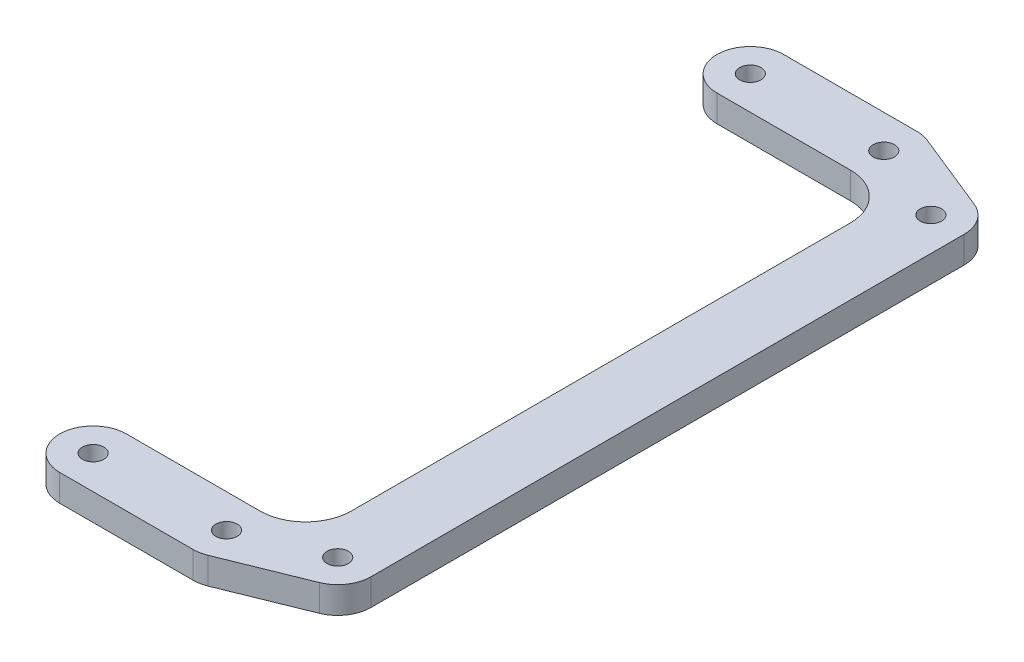
ISO-10303-21;
HEADER;
FILE_DESCRIPTION(('STEP AP214'),'2;1');
FILE_NAME('part.step','',(''),(''),'','','');
FILE_SCHEMA(('AUTOMOTIVE_DESIGN { 1 0 10303 214 1 1 1 1 }'));
ENDSEC;
DATA;
#1=APPLICATION_CONTEXT('core data for automotive mechanical design processes');
#2=APPLICATION_PROTOCOL_DEFINITION('international standard','automotive_design',2000,#1);
#3=PRODUCT_CONTEXT('',#1,'mechanical');
#4=PRODUCT('Part','Part','',(#3));
#5=PRODUCT_RELATED_PRODUCT_CATEGORY('part','',(#4));
#6=PRODUCT_DEFINITION_FORMATION('','',#4);
#7=PRODUCT_DEFINITION_CONTEXT('part definition',#1,'design');
#8=PRODUCT_DEFINITION('design','',#6,#7);
#9=PRODUCT_DEFINITION_SHAPE('','',#8);
#10=(LENGTH_UNIT() NAMED_UNIT(*) SI_UNIT(.MILLI.,.METRE.));
#11=(NAMED_UNIT(*) PLANE_ANGLE_UNIT() SI_UNIT($,.RADIAN.));
#12=(NAMED_UNIT(*) SI_UNIT($,.STERADIAN.) SOLID_ANGLE_UNIT());
#13=UNCERTAINTY_MEASURE_WITH_UNIT(LENGTH_MEASURE(1.E-05),#10,'distance_accuracy_value','');
#14=(GEOMETRIC_REPRESENTATION_CONTEXT(3) GLOBAL_UNCERTAINTY_ASSIGNED_CONTEXT((#13)) GLOBAL_UNIT_ASSIGNED_CONTEXT((#10,
#11,#12)) REPRESENTATION_CONTEXT('',''));
#15=CARTESIAN_POINT('',(0.,0.,0.));
#16=DIRECTION('',(0.,0.,1.));
#17=DIRECTION('',(1.,0.,0.));
#18=AXIS2_PLACEMENT_3D('',#15,#16,#17);
#19=CARTESIAN_POINT('',(19.0029318751509,4.,46.9530775081852));
#20=DIRECTION('',(-0.375160778388513,0.,-0.926959756601615));
#21=DIRECTION('',(-0.926959756601615,0.,0.375160778388513));
#22=AXIS2_PLACEMENT_3D('',#19,#20,#21);
#23=PLANE('',#22);
#24=DIRECTION('',(0.926959756601615,0.,-0.375160778388513));
#25=VECTOR('',#24,1.);
#26=CARTESIAN_POINT('',(19.0029318751509,0.,46.9530775081852));
#27=LINE('',#26,#25);
#28=CARTESIAN_POINT('',(1.87580389194258,0.,53.8847987830081));
#29=VERTEX_POINT('',#28);
#30=CARTESIAN_POINT('',(13.7358038919426,0.,49.0847987830081));
#31=VERTEX_POINT('',#30);
#32=EDGE_CURVE('E201',#29,#31,#27,.T.);
#33=ORIENTED_EDGE('',*,*,#32,.T.);
#34=DIRECTION('',(0.,-1.,0.));
#35=VECTOR('',#34,1.);
#36=CARTESIAN_POINT('',(13.7358038919426,4.,49.0847987830081));
#37=LINE('',#36,#35);
#38=CARTESIAN_POINT('',(13.7358038919426,4.,49.0847987830081));
#39=VERTEX_POINT('',#38);
#40=EDGE_CURVE('E11',#39,#31,#37,.T.);
#41=ORIENTED_EDGE('',*,*,#40,.F.);
#42=DIRECTION('',(0.926959756601615,0.,-0.375160778388513));
#43=VECTOR('',#42,1.);
#44=CARTESIAN_POINT('',(19.0029318751509,4.,46.9530775081852));
#45=LINE('',#44,#43);
#46=CARTESIAN_POINT('',(1.87580389194258,4.,53.8847987830081));
#47=VERTEX_POINT('',#46);
#48=EDGE_CURVE('E260',#47,#39,#45,.T.);
#49=ORIENTED_EDGE('',*,*,#48,.F.);
#50=DIRECTION('',(0.,-1.,0.));
#51=VECTOR('',#50,1.);
#52=CARTESIAN_POINT('',(1.87580389194258,4.,53.8847987830081));
#53=LINE('',#52,#51);
#54=EDGE_CURVE('E51',#47,#29,#53,.T.);
#55=ORIENTED_EDGE('',*,*,#54,.T.);
#56=EDGE_LOOP('',(#33,#41,#49,#55));
#57=FACE_BOUND('',#56,.T.);
#58=ADVANCED_FACE('F35',(#57),#23,.F.);
#59=CARTESIAN_POINT('',(11.86,4.,44.45));
#60=DIRECTION('',(0.,-1.,0.));
#61=DIRECTION('',(0.,0.,-1.));
#62=AXIS2_PLACEMENT_3D('',#59,#60,#61);
#63=CYLINDRICAL_SURFACE('',#62,5.00000000000001);
#64=CARTESIAN_POINT('',(11.86,0.,44.45));
#65=DIRECTION('',(0.,1.,0.));
#66=DIRECTION('',(0.,0.,1.));
#67=AXIS2_PLACEMENT_3D('',#64,#65,#66);
#68=CIRCLE('',#67,5.00000000000001);
#69=CARTESIAN_POINT('',(16.86,0.,44.45));
#70=VERTEX_POINT('',#69);
#71=EDGE_CURVE('E203',#31,#70,#68,.T.);
#72=ORIENTED_EDGE('',*,*,#71,.T.);
#73=DIRECTION('',(0.,-1.,0.));
#74=VECTOR('',#73,1.);
#75=CARTESIAN_POINT('',(16.86,4.,44.45));
#76=LINE('',#75,#74);
#77=CARTESIAN_POINT('',(16.86,4.,44.45));
#78=VERTEX_POINT('',#77);
#79=EDGE_CURVE('E43',#78,#70,#76,.T.);
#80=ORIENTED_EDGE('',*,*,#79,.F.);
#81=CARTESIAN_POINT('',(11.86,4.,44.45));
#82=DIRECTION('',(0.,1.,0.));
#83=DIRECTION('',(0.,0.,1.));
#84=AXIS2_PLACEMENT_3D('',#81,#82,#83);
#85=CIRCLE('',#84,5.00000000000001);
#86=EDGE_CURVE('E114',#39,#78,#85,.T.);
#87=ORIENTED_EDGE('',*,*,#86,.F.);
#88=ORIENTED_EDGE('',*,*,#40,.T.);
#89=EDGE_LOOP('',(#72,#80,#87,#88));
#90=FACE_BOUND('',#89,.T.);
#91=ADVANCED_FACE('F292',(#90),#63,.T.);
#92=CARTESIAN_POINT('',(16.86,4.,0.));
#93=DIRECTION('',(1.,0.,0.));
#94=DIRECTION('',(0.,0.,-1.));
#95=AXIS2_PLACEMENT_3D('',#92,#93,#94);
#96=PLANE('',#95);
#97=DIRECTION('',(0.,0.,1.));
#98=VECTOR('',#97,1.);
#99=CARTESIAN_POINT('',(16.86,0.,0.));
#100=LINE('',#99,#98);
#101=CARTESIAN_POINT('',(16.86,0.,-44.45));
#102=VERTEX_POINT('',#101);
#103=EDGE_CURVE('E206',#102,#70,#100,.T.);
#104=ORIENTED_EDGE('',*,*,#103,.F.);
#105=DIRECTION('',(0.,-1.,0.));
#106=VECTOR('',#105,1.);
#107=CARTESIAN_POINT('',(16.86,4.,-44.45));
#108=LINE('',#107,#106);
#109=CARTESIAN_POINT('',(16.86,4.,-44.45));
#110=VERTEX_POINT('',#109);
#111=EDGE_CURVE('E285',#110,#102,#108,.T.);
#112=ORIENTED_EDGE('',*,*,#111,.F.);
#113=DIRECTION('',(0.,0.,1.));
#114=VECTOR('',#113,1.);
#115=CARTESIAN_POINT('',(16.86,4.,0.));
#116=LINE('',#115,#114);
#117=EDGE_CURVE('E291',#110,#78,#116,.T.);
#118=ORIENTED_EDGE('',*,*,#117,.T.);
#119=ORIENTED_EDGE('',*,*,#79,.T.);
#120=EDGE_LOOP('',(#104,#112,#118,#119));
#121=FACE_BOUND('',#120,.T.);
#122=ADVANCED_FACE('F289',(#121),#96,.T.);
#123=CARTESIAN_POINT('',(11.86,4.,-44.45));
#124=DIRECTION('',(0.,-1.,0.));
#125=DIRECTION('',(0.,0.,-1.));
#126=AXIS2_PLACEMENT_3D('',#123,#124,#125);
#127=CYLINDRICAL_SURFACE('',#126,5.00000000000001);
#128=CARTESIAN_POINT('',(11.86,0.,-44.45));
#129=DIRECTION('',(0.,1.,0.));
#130=DIRECTION('',(0.,0.,1.));
#131=AXIS2_PLACEMENT_3D('',#128,#129,#130);
#132=CIRCLE('',#131,5.00000000000001);
#133=CARTESIAN_POINT('',(13.7358038919426,0.,-49.0847987830081));
#134=VERTEX_POINT('',#133);
#135=EDGE_CURVE('E209',#102,#134,#132,.T.);
#136=ORIENTED_EDGE('',*,*,#135,.T.);
#137=DIRECTION('',(0.,-1.,0.));
#138=VECTOR('',#137,1.);
#139=CARTESIAN_POINT('',(13.7358038919426,4.,-49.0847987830081));
#140=LINE('',#139,#138);
#141=CARTESIAN_POINT('',(13.7358038919426,4.,-49.0847987830081));
#142=VERTEX_POINT('',#141);
#143=EDGE_CURVE('E283',#142,#134,#140,.T.);
#144=ORIENTED_EDGE('',*,*,#143,.F.);
#145=CARTESIAN_POINT('',(11.86,4.,-44.45));
#146=DIRECTION('',(0.,1.,0.));
#147=DIRECTION('',(0.,0.,1.));
#148=AXIS2_PLACEMENT_3D('',#145,#146,#147);
#149=CIRCLE('',#148,5.00000000000001);
#150=EDGE_CURVE('E305',#110,#142,#149,.T.);
#151=ORIENTED_EDGE('',*,*,#150,.F.);
#152=ORIENTED_EDGE('',*,*,#111,.T.);
#153=EDGE_LOOP('',(#136,#144,#151,#152));
#154=FACE_BOUND('',#153,.T.);
#155=ADVANCED_FACE('F302',(#154),#127,.T.);
#156=CARTESIAN_POINT('',(19.0029318751509,4.,-46.9530775081852));
#157=DIRECTION('',(0.375160778388513,0.,-0.926959756601615));
#158=DIRECTION('',(-0.926959756601615,0.,-0.375160778388513));
#159=AXIS2_PLACEMENT_3D('',#156,#157,#158);
#160=PLANE('',#159);
#161=DIRECTION('',(0.926959756601615,0.,0.375160778388513));
#162=VECTOR('',#161,1.);
#163=CARTESIAN_POINT('',(19.0029318751509,0.,-46.9530775081852));
#164=LINE('',#163,#162);
#165=CARTESIAN_POINT('',(1.87580389194258,0.,-53.8847987830081));
#166=VERTEX_POINT('',#165);
#167=EDGE_CURVE('E212',#166,#134,#164,.T.);
#168=ORIENTED_EDGE('',*,*,#167,.F.);
#169=DIRECTION('',(0.,-1.,0.));
#170=VECTOR('',#169,1.);
#171=CARTESIAN_POINT('',(1.87580389194258,4.,-53.8847987830081));
#172=LINE('',#171,#170);
#173=CARTESIAN_POINT('',(1.87580389194258,4.,-53.8847987830081));
#174=VERTEX_POINT('',#173);
#175=EDGE_CURVE('E281',#174,#166,#172,.T.);
#176=ORIENTED_EDGE('',*,*,#175,.F.);
#177=DIRECTION('',(0.926959756601615,0.,0.375160778388513));
#178=VECTOR('',#177,1.);
#179=CARTESIAN_POINT('',(19.0029318751509,4.,-46.9530775081852));
#180=LINE('',#179,#178);
#181=EDGE_CURVE('E307',#174,#142,#180,.T.);
#182=ORIENTED_EDGE('',*,*,#181,.T.);
#183=ORIENTED_EDGE('',*,*,#143,.T.);
#184=EDGE_LOOP('',(#168,#176,#182,#183));
#185=FACE_BOUND('',#184,.T.);
#186=ADVANCED_FACE('F361',(#185),#160,.T.);
#187=CARTESIAN_POINT('',(0.,4.,-49.25));
#188=DIRECTION('',(0.,-1.,0.));
#189=DIRECTION('',(0.,0.,-1.));
#190=AXIS2_PLACEMENT_3D('',#187,#188,#189);
#191=CYLINDRICAL_SURFACE('',#190,5.);
#192=CARTESIAN_POINT('',(0.,0.,-49.25));
#193=DIRECTION('',(0.,1.,0.));
#194=DIRECTION('',(0.,0.,1.));
#195=AXIS2_PLACEMENT_3D('',#192,#193,#194);
#196=CIRCLE('',#195,5.);
#197=CARTESIAN_POINT('',(0.,0.,-54.25));
#198=VERTEX_POINT('',#197);
#199=EDGE_CURVE('E215',#166,#198,#196,.T.);
#200=ORIENTED_EDGE('',*,*,#199,.T.);
#201=DIRECTION('',(0.,-1.,0.));
#202=VECTOR('',#201,1.);
#203=CARTESIAN_POINT('',(0.,4.,-54.25));
#204=LINE('',#203,#202);
#205=CARTESIAN_POINT('',(0.,4.,-54.25));
#206=VERTEX_POINT('',#205);
#207=EDGE_CURVE('E279',#206,#198,#204,.T.);
#208=ORIENTED_EDGE('',*,*,#207,.F.);
#209=CARTESIAN_POINT('',(0.,4.,-49.25));
#210=DIRECTION('',(0.,1.,0.));
#211=DIRECTION('',(0.,0.,1.));
#212=AXIS2_PLACEMENT_3D('',#209,#210,#211);
#213=CIRCLE('',#212,5.);
#214=EDGE_CURVE('E314',#174,#206,#213,.T.);
#215=ORIENTED_EDGE('',*,*,#214,.F.);
#216=ORIENTED_EDGE('',*,*,#175,.T.);
#217=EDGE_LOOP('',(#200,#208,#215,#216));
#218=FACE_BOUND('',#217,.T.);
#219=ADVANCED_FACE('F364',(#218),#191,.T.);
#220=CARTESIAN_POINT('',(0.,4.,-54.25));
#221=DIRECTION('',(0.,0.,-1.));
#222=DIRECTION('',(-1.,0.,0.));
#223=AXIS2_PLACEMENT_3D('',#220,#221,#222);
#224=PLANE('',#223);
#225=DIRECTION('',(1.,0.,0.));
#226=VECTOR('',#225,1.);
#227=CARTESIAN_POINT('',(0.,0.,-54.25));
#228=LINE('',#227,#226);
#229=CARTESIAN_POINT('',(-20.,0.,-54.25));
#230=VERTEX_POINT('',#229);
#231=EDGE_CURVE('E218',#230,#198,#228,.T.);
#232=ORIENTED_EDGE('',*,*,#231,.F.);
#233=DIRECTION('',(0.,-1.,0.));
#234=VECTOR('',#233,1.);
#235=CARTESIAN_POINT('',(-20.,4.,-54.25));
#236=LINE('',#235,#234);
#237=CARTESIAN_POINT('',(-20.,4.,-54.25));
#238=VERTEX_POINT('',#237);
#239=EDGE_CURVE('E277',#238,#230,#236,.T.);
#240=ORIENTED_EDGE('',*,*,#239,.F.);
#241=DIRECTION('',(1.,0.,0.));
#242=VECTOR('',#241,1.);
#243=CARTESIAN_POINT('',(0.,4.,-54.25));
#244=LINE('',#243,#242);
#245=EDGE_CURVE('E316',#238,#206,#244,.T.);
#246=ORIENTED_EDGE('',*,*,#245,.T.);
#247=ORIENTED_EDGE('',*,*,#207,.T.);
#248=EDGE_LOOP('',(#232,#240,#246,#247));
#249=FACE_BOUND('',#248,.T.);
#250=ADVANCED_FACE('F368',(#249),#224,.T.);
#251=CARTESIAN_POINT('',(-20.,4.,-49.25));
#252=DIRECTION('',(0.,-1.,0.));
#253=DIRECTION('',(0.,0.,-1.));
#254=AXIS2_PLACEMENT_3D('',#251,#252,#253);
#255=CYLINDRICAL_SURFACE('',#254,5.);
#256=CARTESIAN_POINT('',(-20.,0.,-49.25));
#257=DIRECTION('',(0.,1.,0.));
#258=DIRECTION('',(0.,0.,1.));
#259=AXIS2_PLACEMENT_3D('',#256,#257,#258);
#260=CIRCLE('',#259,5.);
#261=CARTESIAN_POINT('',(-20.,0.,-44.25));
#262=VERTEX_POINT('',#261);
#263=EDGE_CURVE('E221',#230,#262,#260,.T.);
#264=ORIENTED_EDGE('',*,*,#263,.T.);
#265=DIRECTION('',(0.,-1.,0.));
#266=VECTOR('',#265,1.);
#267=CARTESIAN_POINT('',(-20.,4.,-44.25));
#268=LINE('',#267,#266);
#269=CARTESIAN_POINT('',(-20.,4.,-44.25));
#270=VERTEX_POINT('',#269);
#271=EDGE_CURVE('E274',#270,#262,#268,.T.);
#272=ORIENTED_EDGE('',*,*,#271,.F.);
#273=CARTESIAN_POINT('',(-20.,4.,-49.25));
#274=DIRECTION('',(0.,1.,0.));
#275=DIRECTION('',(0.,0.,1.));
#276=AXIS2_PLACEMENT_3D('',#273,#274,#275);
#277=CIRCLE('',#276,5.);
#278=EDGE_CURVE('E319',#238,#270,#277,.T.);
#279=ORIENTED_EDGE('',*,*,#278,.F.);
#280=ORIENTED_EDGE('',*,*,#239,.T.);
#281=EDGE_LOOP('',(#264,#272,#279,#280));
#282=FACE_BOUND('',#281,.T.);
#283=ADVANCED_FACE('F372',(#282),#255,.T.);
#284=CARTESIAN_POINT('',(0.,4.,-44.25));
#285=DIRECTION('',(0.,0.,-1.));
#286=DIRECTION('',(-1.,0.,0.));
#287=AXIS2_PLACEMENT_3D('',#284,#285,#286);
#288=PLANE('',#287);
#289=DIRECTION('',(1.,0.,0.));
#290=VECTOR('',#289,1.);
#291=CARTESIAN_POINT('',(0.,0.,-44.25));
#292=LINE('',#291,#290);
#293=CARTESIAN_POINT('',(0.,0.,-44.25));
#294=VERTEX_POINT('',#293);
#295=EDGE_CURVE('E223',#262,#294,#292,.T.);
#296=ORIENTED_EDGE('',*,*,#295,.T.);
#297=DIRECTION('',(0.,-1.,0.));
#298=VECTOR('',#297,1.);
#299=CARTESIAN_POINT('',(0.,4.,-44.25));
#300=LINE('',#299,#298);
#301=CARTESIAN_POINT('',(0.,4.,-44.25));
#302=VERTEX_POINT('',#301);
#303=EDGE_CURVE('E271',#302,#294,#300,.T.);
#304=ORIENTED_EDGE('',*,*,#303,.F.);
#305=DIRECTION('',(1.,0.,0.));
#306=VECTOR('',#305,1.);
#307=CARTESIAN_POINT('',(0.,4.,-44.25));
#308=LINE('',#307,#306);
#309=EDGE_CURVE('E321',#270,#302,#308,.T.);
#310=ORIENTED_EDGE('',*,*,#309,.F.);
#311=ORIENTED_EDGE('',*,*,#271,.T.);
#312=EDGE_LOOP('',(#296,#304,#310,#311));
#313=FACE_BOUND('',#312,.T.);
#314=ADVANCED_FACE('F376',(#313),#288,.F.);
#315=CARTESIAN_POINT('',(0.,4.,-37.39));
#316=DIRECTION('',(0.,-1.,0.));
#317=DIRECTION('',(0.,0.,-1.));
#318=AXIS2_PLACEMENT_3D('',#315,#316,#317);
#319=CYLINDRICAL_SURFACE('',#318,6.86);
#320=CARTESIAN_POINT('',(0.,0.,-37.39));
#321=DIRECTION('',(0.,1.,0.));
#322=DIRECTION('',(0.,0.,1.));
#323=AXIS2_PLACEMENT_3D('',#320,#321,#322);
#324=CIRCLE('',#323,6.86);
#325=CARTESIAN_POINT('',(6.86,0.,-37.39));
#326=VERTEX_POINT('',#325);
#327=EDGE_CURVE('E225',#294,#326,#324,.F.);
#328=ORIENTED_EDGE('',*,*,#327,.T.);
#329=DIRECTION('',(0.,-1.,0.));
#330=VECTOR('',#329,1.);
#331=CARTESIAN_POINT('',(6.86,4.,-37.39));
#332=LINE('',#331,#330);
#333=CARTESIAN_POINT('',(6.86,4.,-37.39));
#334=VERTEX_POINT('',#333);
#335=EDGE_CURVE('E268',#334,#326,#332,.T.);
#336=ORIENTED_EDGE('',*,*,#335,.F.);
#337=CARTESIAN_POINT('',(0.,4.,-37.39));
#338=DIRECTION('',(0.,1.,0.));
#339=DIRECTION('',(0.,0.,1.));
#340=AXIS2_PLACEMENT_3D('',#337,#338,#339);
#341=CIRCLE('',#340,6.86);
#342=EDGE_CURVE('E323',#302,#334,#341,.F.);
#343=ORIENTED_EDGE('',*,*,#342,.F.);
#344=ORIENTED_EDGE('',*,*,#303,.T.);
#345=EDGE_LOOP('',(#328,#336,#343,#344));
#346=FACE_BOUND('',#345,.T.);
#347=ADVANCED_FACE('F380',(#346),#319,.F.);
#348=CARTESIAN_POINT('',(6.86,4.,0.));
#349=DIRECTION('',(1.,0.,0.));
#350=DIRECTION('',(0.,0.,-1.));
#351=AXIS2_PLACEMENT_3D('',#348,#349,#350);
#352=PLANE('',#351);
#353=DIRECTION('',(0.,0.,1.));
#354=VECTOR('',#353,1.);
#355=CARTESIAN_POINT('',(6.86,0.,0.));
#356=LINE('',#355,#354);
#357=CARTESIAN_POINT('',(6.86,0.,37.39));
#358=VERTEX_POINT('',#357);
#359=EDGE_CURVE('E227',#326,#358,#356,.T.);
#360=ORIENTED_EDGE('',*,*,#359,.T.);
#361=DIRECTION('',(0.,-1.,0.));
#362=VECTOR('',#361,1.);
#363=CARTESIAN_POINT('',(6.86,4.,37.39));
#364=LINE('',#363,#362);
#365=CARTESIAN_POINT('',(6.86,4.,37.39));
#366=VERTEX_POINT('',#365);
#367=EDGE_CURVE('E266',#366,#358,#364,.T.);
#368=ORIENTED_EDGE('',*,*,#367,.F.);
#369=DIRECTION('',(0.,0.,1.));
#370=VECTOR('',#369,1.);
#371=CARTESIAN_POINT('',(6.86,4.,0.));
#372=LINE('',#371,#370);
#373=EDGE_CURVE('E325',#334,#366,#372,.T.);
#374=ORIENTED_EDGE('',*,*,#373,.F.);
#375=ORIENTED_EDGE('',*,*,#335,.T.);
#376=EDGE_LOOP('',(#360,#368,#374,#375));
#377=FACE_BOUND('',#376,.T.);
#378=ADVANCED_FACE('F384',(#377),#352,.F.);
#379=CARTESIAN_POINT('',(0.,4.,37.39));
#380=DIRECTION('',(0.,-1.,0.));
#381=DIRECTION('',(0.,0.,-1.));
#382=AXIS2_PLACEMENT_3D('',#379,#380,#381);
#383=CYLINDRICAL_SURFACE('',#382,6.86);
#384=CARTESIAN_POINT('',(0.,0.,37.39));
#385=DIRECTION('',(0.,1.,0.));
#386=DIRECTION('',(0.,0.,1.));
#387=AXIS2_PLACEMENT_3D('',#384,#385,#386);
#388=CIRCLE('',#387,6.86);
#389=CARTESIAN_POINT('',(0.,0.,44.25));
#390=VERTEX_POINT('',#389);
#391=EDGE_CURVE('E230',#390,#358,#388,.T.);
#392=ORIENTED_EDGE('',*,*,#391,.F.);
#393=DIRECTION('',(0.,-1.,0.));
#394=VECTOR('',#393,1.);
#395=CARTESIAN_POINT('',(0.,4.,44.25));
#396=LINE('',#395,#394);
#397=CARTESIAN_POINT('',(0.,4.,44.25));
#398=VERTEX_POINT('',#397);
#399=EDGE_CURVE('E264',#398,#390,#396,.T.);
#400=ORIENTED_EDGE('',*,*,#399,.F.);
#401=CARTESIAN_POINT('',(0.,4.,37.39));
#402=DIRECTION('',(0.,1.,0.));
#403=DIRECTION('',(0.,0.,1.));
#404=AXIS2_PLACEMENT_3D('',#401,#402,#403);
#405=CIRCLE('',#404,6.86);
#406=EDGE_CURVE('E178',#398,#366,#405,.T.);
#407=ORIENTED_EDGE('',*,*,#406,.T.);
#408=ORIENTED_EDGE('',*,*,#367,.T.);
#409=EDGE_LOOP('',(#392,#400,#407,#408));
#410=FACE_BOUND('',#409,.T.);
#411=ADVANCED_FACE('F329',(#410),#383,.F.);
#412=CARTESIAN_POINT('',(0.,4.,44.25));
#413=DIRECTION('',(0.,0.,-1.));
#414=DIRECTION('',(-1.,0.,0.));
#415=AXIS2_PLACEMENT_3D('',#412,#413,#414);
#416=PLANE('',#415);
#417=DIRECTION('',(1.,0.,0.));
#418=VECTOR('',#417,1.);
#419=CARTESIAN_POINT('',(0.,0.,44.25));
#420=LINE('',#419,#418);
#421=CARTESIAN_POINT('',(-20.,0.,44.25));
#422=VERTEX_POINT('',#421);
#423=EDGE_CURVE('E233',#422,#390,#420,.T.);
#424=ORIENTED_EDGE('',*,*,#423,.F.);
#425=DIRECTION('',(0.,-1.,0.));
#426=VECTOR('',#425,1.);
#427=CARTESIAN_POINT('',(-20.,4.,44.25));
#428=LINE('',#427,#426);
#429=CARTESIAN_POINT('',(-20.,4.,44.25));
#430=VERTEX_POINT('',#429);
#431=EDGE_CURVE('E163',#430,#422,#428,.T.);
#432=ORIENTED_EDGE('',*,*,#431,.F.);
#433=DIRECTION('',(1.,0.,0.));
#434=VECTOR('',#433,1.);
#435=CARTESIAN_POINT('',(0.,4.,44.25));
#436=LINE('',#435,#434);
#437=EDGE_CURVE('E176',#430,#398,#436,.T.);
#438=ORIENTED_EDGE('',*,*,#437,.T.);
#439=ORIENTED_EDGE('',*,*,#399,.T.);
#440=EDGE_LOOP('',(#424,#432,#438,#439));
#441=FACE_BOUND('',#440,.T.);
#442=ADVANCED_FACE('F334',(#441),#416,.T.);
#443=CARTESIAN_POINT('',(-20.,4.,49.25));
#444=DIRECTION('',(0.,-1.,0.));
#445=DIRECTION('',(0.,0.,-1.));
#446=AXIS2_PLACEMENT_3D('',#443,#444,#445);
#447=CYLINDRICAL_SURFACE('',#446,5.);
#448=CARTESIAN_POINT('',(-20.,0.,49.25));
#449=DIRECTION('',(0.,1.,0.));
#450=DIRECTION('',(0.,0.,1.));
#451=AXIS2_PLACEMENT_3D('',#448,#449,#450);
#452=CIRCLE('',#451,5.);
#453=CARTESIAN_POINT('',(-20.,0.,54.25));
#454=VERTEX_POINT('',#453);
#455=EDGE_CURVE('E160',#454,#422,#452,.F.);
#456=ORIENTED_EDGE('',*,*,#455,.F.);
#457=DIRECTION('',(0.,-1.,0.));
#458=VECTOR('',#457,1.);
#459=CARTESIAN_POINT('',(-20.,4.,54.25));
#460=LINE('',#459,#458);
#461=CARTESIAN_POINT('',(-20.,4.,54.25));
#462=VERTEX_POINT('',#461);
#463=EDGE_CURVE('E154',#462,#454,#460,.T.);
#464=ORIENTED_EDGE('',*,*,#463,.F.);
#465=CARTESIAN_POINT('',(-20.,4.,49.25));
#466=DIRECTION('',(0.,1.,0.));
#467=DIRECTION('',(0.,0.,1.));
#468=AXIS2_PLACEMENT_3D('',#465,#466,#467);
#469=CIRCLE('',#468,5.);
#470=EDGE_CURVE('E158',#462,#430,#469,.F.);
#471=ORIENTED_EDGE('',*,*,#470,.T.);
#472=ORIENTED_EDGE('',*,*,#431,.T.);
#473=EDGE_LOOP('',(#456,#464,#471,#472));
#474=FACE_BOUND('',#473,.T.);
#475=ADVANCED_FACE('F156',(#474),#447,.T.);
#476=CARTESIAN_POINT('',(0.,4.,54.25));
#477=DIRECTION('',(0.,0.,-1.));
#478=DIRECTION('',(-1.,0.,0.));
#479=AXIS2_PLACEMENT_3D('',#476,#477,#478);
#480=PLANE('',#479);
#481=DIRECTION('',(1.,0.,0.));
#482=VECTOR('',#481,1.);
#483=CARTESIAN_POINT('',(0.,0.,54.25));
#484=LINE('',#483,#482);
#485=CARTESIAN_POINT('',(0.,0.,54.25));
#486=VERTEX_POINT('',#485);
#487=EDGE_CURVE('E237',#454,#486,#484,.T.);
#488=ORIENTED_EDGE('',*,*,#487,.T.);
#489=DIRECTION('',(0.,-1.,0.));
#490=VECTOR('',#489,1.);
#491=CARTESIAN_POINT('',(0.,4.,54.25));
#492=LINE('',#491,#490);
#493=CARTESIAN_POINT('',(0.,4.,54.25));
#494=VERTEX_POINT('',#493);
#495=EDGE_CURVE('E102',#494,#486,#492,.T.);
#496=ORIENTED_EDGE('',*,*,#495,.F.);
#497=DIRECTION('',(1.,0.,0.));
#498=VECTOR('',#497,1.);
#499=CARTESIAN_POINT('',(0.,4.,54.25));
#500=LINE('',#499,#498);
#501=EDGE_CURVE('E165',#462,#494,#500,.T.);
#502=ORIENTED_EDGE('',*,*,#501,.F.);
#503=ORIENTED_EDGE('',*,*,#463,.T.);
#504=EDGE_LOOP('',(#488,#496,#502,#503));
#505=FACE_BOUND('',#504,.T.);
#506=ADVANCED_FACE('F166',(#505),#480,.F.);
#507=CARTESIAN_POINT('',(-20.,4.,49.25));
#508=DIRECTION('',(0.,-1.,0.));
#509=DIRECTION('',(0.,0.,-1.));
#510=AXIS2_PLACEMENT_3D('',#507,#508,#509);
#511=CYLINDRICAL_SURFACE('',#510,1.6);
#512=CARTESIAN_POINT('',(-20.,4.,49.25));
#513=DIRECTION('',(0.,1.,0.));
#514=DIRECTION('',(0.,0.,1.));
#515=AXIS2_PLACEMENT_3D('',#512,#513,#514);
#516=CIRCLE('',#515,1.6);
#517=CARTESIAN_POINT('',(-20.,4.,50.85));
#518=VERTEX_POINT('',#517);
#519=EDGE_CURVE('E195',#518,#518,#516,.F.);
#520=ORIENTED_EDGE('',*,*,#519,.F.);
#521=EDGE_LOOP('',(#520));
#522=FACE_BOUND('',#521,.T.);
#523=CARTESIAN_POINT('',(-20.,0.,49.25));
#524=DIRECTION('',(0.,1.,0.));
#525=DIRECTION('',(0.,0.,1.));
#526=AXIS2_PLACEMENT_3D('',#523,#524,#525);
#527=CIRCLE('',#526,1.6);
#528=CARTESIAN_POINT('',(-20.,0.,50.85));
#529=VERTEX_POINT('',#528);
#530=EDGE_CURVE('E254',#529,#529,#527,.F.);
#531=ORIENTED_EDGE('',*,*,#530,.T.);
#532=EDGE_LOOP('',(#531));
#533=FACE_BOUND('',#532,.T.);
#534=ADVANCED_FACE('F395',(#522,#533),#511,.F.);
#535=CARTESIAN_POINT('',(11.86,4.,-44.45));
#536=DIRECTION('',(0.,-1.,0.));
#537=DIRECTION('',(0.,0.,-1.));
#538=AXIS2_PLACEMENT_3D('',#535,#536,#537);
#539=CYLINDRICAL_SURFACE('',#538,1.6);
#540=CARTESIAN_POINT('',(11.86,4.,-44.45));
#541=DIRECTION('',(0.,1.,0.));
#542=DIRECTION('',(0.,0.,1.));
#543=AXIS2_PLACEMENT_3D('',#540,#541,#542);
#544=CIRCLE('',#543,1.6);
#545=CARTESIAN_POINT('',(11.86,4.,-42.85));
#546=VERTEX_POINT('',#545);
#547=EDGE_CURVE('E192',#546,#546,#544,.T.);
#548=ORIENTED_EDGE('',*,*,#547,.T.);
#549=EDGE_LOOP('',(#548));
#550=FACE_BOUND('',#549,.T.);
#551=CARTESIAN_POINT('',(11.86,0.,-44.45));
#552=DIRECTION('',(0.,1.,0.));
#553=DIRECTION('',(0.,0.,1.));
#554=AXIS2_PLACEMENT_3D('',#551,#552,#553);
#555=CIRCLE('',#554,1.6);
#556=CARTESIAN_POINT('',(11.86,0.,-42.85));
#557=VERTEX_POINT('',#556);
#558=EDGE_CURVE('E251',#557,#557,#555,.T.);
#559=ORIENTED_EDGE('',*,*,#558,.F.);
#560=EDGE_LOOP('',(#559));
#561=FACE_BOUND('',#560,.T.);
#562=ADVANCED_FACE('F399',(#550,#561),#539,.F.);
#563=CARTESIAN_POINT('',(11.86,4.,44.45));
#564=DIRECTION('',(0.,-1.,0.));
#565=DIRECTION('',(0.,0.,-1.));
#566=AXIS2_PLACEMENT_3D('',#563,#564,#565);
#567=CYLINDRICAL_SURFACE('',#566,1.6);
#568=CARTESIAN_POINT('',(11.86,4.,44.45));
#569=DIRECTION('',(0.,1.,0.));
#570=DIRECTION('',(0.,0.,1.));
#571=AXIS2_PLACEMENT_3D('',#568,#569,#570);
#572=CIRCLE('',#571,1.6);
#573=CARTESIAN_POINT('',(11.86,4.,46.05));
#574=VERTEX_POINT('',#573);
#575=EDGE_CURVE('E189',#574,#574,#572,.F.);
#576=ORIENTED_EDGE('',*,*,#575,.F.);
#577=EDGE_LOOP('',(#576));
#578=FACE_BOUND('',#577,.T.);
#579=CARTESIAN_POINT('',(11.86,0.,44.45));
#580=DIRECTION('',(0.,1.,0.));
#581=DIRECTION('',(0.,0.,1.));
#582=AXIS2_PLACEMENT_3D('',#579,#580,#581);
#583=CIRCLE('',#582,1.6);
#584=CARTESIAN_POINT('',(11.86,0.,46.05));
#585=VERTEX_POINT('',#584);
#586=EDGE_CURVE('E248',#585,#585,#583,.F.);
#587=ORIENTED_EDGE('',*,*,#586,.T.);
#588=EDGE_LOOP('',(#587));
#589=FACE_BOUND('',#588,.T.);
#590=ADVANCED_FACE('F405',(#578,#589),#567,.F.);
#591=CARTESIAN_POINT('',(-20.,4.,-49.25));
#592=DIRECTION('',(0.,-1.,0.));
#593=DIRECTION('',(0.,0.,-1.));
#594=AXIS2_PLACEMENT_3D('',#591,#592,#593);
#595=CYLINDRICAL_SURFACE('',#594,1.6);
#596=CARTESIAN_POINT('',(-20.,4.,-49.25));
#597=DIRECTION('',(0.,1.,0.));
#598=DIRECTION('',(0.,0.,1.));
#599=AXIS2_PLACEMENT_3D('',#596,#597,#598);
#600=CIRCLE('',#599,1.6);
#601=CARTESIAN_POINT('',(-20.,4.,-47.65));
#602=VERTEX_POINT('',#601);
#603=EDGE_CURVE('E186',#602,#602,#600,.T.);
#604=ORIENTED_EDGE('',*,*,#603,.T.);
#605=EDGE_LOOP('',(#604));
#606=FACE_BOUND('',#605,.T.);
#607=CARTESIAN_POINT('',(-20.,0.,-49.25));
#608=DIRECTION('',(0.,1.,0.));
#609=DIRECTION('',(0.,0.,1.));
#610=AXIS2_PLACEMENT_3D('',#607,#608,#609);
#611=CIRCLE('',#610,1.6);
#612=CARTESIAN_POINT('',(-20.,0.,-47.65));
#613=VERTEX_POINT('',#612);
#614=EDGE_CURVE('E245',#613,#613,#611,.T.);
#615=ORIENTED_EDGE('',*,*,#614,.F.);
#616=EDGE_LOOP('',(#615));
#617=FACE_BOUND('',#616,.T.);
#618=ADVANCED_FACE('F346',(#606,#617),#595,.F.);
#619=CARTESIAN_POINT('',(0.,4.,-49.25));
#620=DIRECTION('',(0.,-1.,0.));
#621=DIRECTION('',(0.,0.,-1.));
#622=AXIS2_PLACEMENT_3D('',#619,#620,#621);
#623=CYLINDRICAL_SURFACE('',#622,1.6);
#624=CARTESIAN_POINT('',(0.,4.,-49.25));
#625=DIRECTION('',(0.,1.,0.));
#626=DIRECTION('',(0.,0.,1.));
#627=AXIS2_PLACEMENT_3D('',#624,#625,#626);
#628=CIRCLE('',#627,1.6);
#629=CARTESIAN_POINT('',(0.,4.,-47.65));
#630=VERTEX_POINT('',#629);
#631=EDGE_CURVE('E183',#630,#630,#628,.T.);
#632=ORIENTED_EDGE('',*,*,#631,.T.);
#633=EDGE_LOOP('',(#632));
#634=FACE_BOUND('',#633,.T.);
#635=CARTESIAN_POINT('',(0.,0.,-49.25));
#636=DIRECTION('',(0.,1.,0.));
#637=DIRECTION('',(0.,0.,1.));
#638=AXIS2_PLACEMENT_3D('',#635,#636,#637);
#639=CIRCLE('',#638,1.6);
#640=CARTESIAN_POINT('',(0.,0.,-47.65));
#641=VERTEX_POINT('',#640);
#642=EDGE_CURVE('E242',#641,#641,#639,.T.);
#643=ORIENTED_EDGE('',*,*,#642,.F.);
#644=EDGE_LOOP('',(#643));
#645=FACE_BOUND('',#644,.T.);
#646=ADVANCED_FACE('F338',(#634,#645),#623,.F.);
#647=CARTESIAN_POINT('',(0.,4.,49.25));
#648=DIRECTION('',(0.,-1.,0.));
#649=DIRECTION('',(0.,0.,-1.));
#650=AXIS2_PLACEMENT_3D('',#647,#648,#649);
#651=CYLINDRICAL_SURFACE('',#650,5.);
#652=CARTESIAN_POINT('',(0.,0.,49.25));
#653=DIRECTION('',(0.,1.,0.));
#654=DIRECTION('',(0.,0.,1.));
#655=AXIS2_PLACEMENT_3D('',#652,#653,#654);
#656=CIRCLE('',#655,5.);
#657=EDGE_CURVE('E239',#29,#486,#656,.F.);
#658=ORIENTED_EDGE('',*,*,#657,.F.);
#659=ORIENTED_EDGE('',*,*,#54,.F.);
#660=CARTESIAN_POINT('',(0.,4.,49.25));
#661=DIRECTION('',(0.,1.,0.));
#662=DIRECTION('',(0.,0.,1.));
#663=AXIS2_PLACEMENT_3D('',#660,#661,#662);
#664=CIRCLE('',#663,5.);
#665=EDGE_CURVE('E169',#47,#494,#664,.F.);
#666=ORIENTED_EDGE('',*,*,#665,.T.);
#667=ORIENTED_EDGE('',*,*,#495,.T.);
#668=EDGE_LOOP('',(#658,#659,#666,#667));
#669=FACE_BOUND('',#668,.T.);
#670=ADVANCED_FACE('F335',(#669),#651,.T.);
#671=CARTESIAN_POINT('',(0.,4.,49.25));
#672=DIRECTION('',(0.,-1.,0.));
#673=DIRECTION('',(0.,0.,-1.));
#674=AXIS2_PLACEMENT_3D('',#671,#672,#673);
#675=CYLINDRICAL_SURFACE('',#674,1.6);
#676=CARTESIAN_POINT('',(0.,4.,49.25));
#677=DIRECTION('',(0.,1.,0.));
#678=DIRECTION('',(0.,0.,1.));
#679=AXIS2_PLACEMENT_3D('',#676,#677,#678);
#680=CIRCLE('',#679,1.6);
#681=CARTESIAN_POINT('',(0.,4.,50.85));
#682=VERTEX_POINT('',#681);
#683=EDGE_CURVE('E198',#682,#682,#680,.F.);
#684=ORIENTED_EDGE('',*,*,#683,.F.);
#685=EDGE_LOOP('',(#684));
#686=FACE_BOUND('',#685,.T.);
#687=CARTESIAN_POINT('',(0.,0.,49.25));
#688=DIRECTION('',(0.,1.,0.));
#689=DIRECTION('',(0.,0.,1.));
#690=AXIS2_PLACEMENT_3D('',#687,#688,#689);
#691=CIRCLE('',#690,1.6);
#692=CARTESIAN_POINT('',(0.,0.,50.85));
#693=VERTEX_POINT('',#692);
#694=EDGE_CURVE('E257',#693,#693,#691,.F.);
#695=ORIENTED_EDGE('',*,*,#694,.T.);
#696=EDGE_LOOP('',(#695));
#697=FACE_BOUND('',#696,.T.);
#698=ADVANCED_FACE('F337',(#686,#697),#675,.F.);
#699=CARTESIAN_POINT('',(0.,4.,0.));
#700=DIRECTION('',(0.,1.,0.));
#701=DIRECTION('',(0.,0.,1.));
#702=AXIS2_PLACEMENT_3D('',#699,#700,#701);
#703=PLANE('',#702);
#704=ORIENTED_EDGE('',*,*,#48,.T.);
#705=ORIENTED_EDGE('',*,*,#86,.T.);
#706=ORIENTED_EDGE('',*,*,#117,.F.);
#707=ORIENTED_EDGE('',*,*,#150,.T.);
#708=ORIENTED_EDGE('',*,*,#181,.F.);
#709=ORIENTED_EDGE('',*,*,#214,.T.);
#710=ORIENTED_EDGE('',*,*,#245,.F.);
#711=ORIENTED_EDGE('',*,*,#278,.T.);
#712=ORIENTED_EDGE('',*,*,#309,.T.);
#713=ORIENTED_EDGE('',*,*,#342,.T.);
#714=ORIENTED_EDGE('',*,*,#373,.T.);
#715=ORIENTED_EDGE('',*,*,#406,.F.);
#716=ORIENTED_EDGE('',*,*,#437,.F.);
#717=ORIENTED_EDGE('',*,*,#470,.F.);
#718=ORIENTED_EDGE('',*,*,#501,.T.);
#719=ORIENTED_EDGE('',*,*,#665,.F.);
#720=EDGE_LOOP('',(#704,#705,#706,#707,#708,#709,#710,#711,#712,#713,#714,#715,#716,#717,#718,#719));
#721=FACE_BOUND('',#720,.T.);
#722=ORIENTED_EDGE('',*,*,#631,.F.);
#723=EDGE_LOOP('',(#722));
#724=FACE_BOUND('',#723,.T.);
#725=ORIENTED_EDGE('',*,*,#603,.F.);
#726=EDGE_LOOP('',(#725));
#727=FACE_BOUND('',#726,.T.);
#728=ORIENTED_EDGE('',*,*,#575,.T.);
#729=EDGE_LOOP('',(#728));
#730=FACE_BOUND('',#729,.T.);
#731=ORIENTED_EDGE('',*,*,#547,.F.);
#732=EDGE_LOOP('',(#731));
#733=FACE_BOUND('',#732,.T.);
#734=ORIENTED_EDGE('',*,*,#519,.T.);
#735=EDGE_LOOP('',(#734));
#736=FACE_BOUND('',#735,.T.);
#737=ORIENTED_EDGE('',*,*,#683,.T.);
#738=EDGE_LOOP('',(#737));
#739=FACE_BOUND('',#738,.T.);
#740=ADVANCED_FACE('F172',(#721,#724,#727,#730,#733,#736,#739),#703,.T.);
#741=CARTESIAN_POINT('',(0.,0.,0.));
#742=DIRECTION('',(0.,1.,0.));
#743=DIRECTION('',(0.,0.,1.));
#744=AXIS2_PLACEMENT_3D('',#741,#742,#743);
#745=PLANE('',#744);
#746=ORIENTED_EDGE('',*,*,#32,.F.);
#747=ORIENTED_EDGE('',*,*,#657,.T.);
#748=ORIENTED_EDGE('',*,*,#487,.F.);
#749=ORIENTED_EDGE('',*,*,#455,.T.);
#750=ORIENTED_EDGE('',*,*,#423,.T.);
#751=ORIENTED_EDGE('',*,*,#391,.T.);
#752=ORIENTED_EDGE('',*,*,#359,.F.);
#753=ORIENTED_EDGE('',*,*,#327,.F.);
#754=ORIENTED_EDGE('',*,*,#295,.F.);
#755=ORIENTED_EDGE('',*,*,#263,.F.);
#756=ORIENTED_EDGE('',*,*,#231,.T.);
#757=ORIENTED_EDGE('',*,*,#199,.F.);
#758=ORIENTED_EDGE('',*,*,#167,.T.);
#759=ORIENTED_EDGE('',*,*,#135,.F.);
#760=ORIENTED_EDGE('',*,*,#103,.T.);
#761=ORIENTED_EDGE('',*,*,#71,.F.);
#762=EDGE_LOOP('',(#746,#747,#748,#749,#750,#751,#752,#753,#754,#755,#756,#757,#758,#759,#760,#761));
#763=FACE_BOUND('',#762,.T.);
#764=ORIENTED_EDGE('',*,*,#642,.T.);
#765=EDGE_LOOP('',(#764));
#766=FACE_BOUND('',#765,.T.);
#767=ORIENTED_EDGE('',*,*,#614,.T.);
#768=EDGE_LOOP('',(#767));
#769=FACE_BOUND('',#768,.T.);
#770=ORIENTED_EDGE('',*,*,#586,.F.);
#771=EDGE_LOOP('',(#770));
#772=FACE_BOUND('',#771,.T.);
#773=ORIENTED_EDGE('',*,*,#558,.T.);
#774=EDGE_LOOP('',(#773));
#775=FACE_BOUND('',#774,.T.);
#776=ORIENTED_EDGE('',*,*,#530,.F.);
#777=EDGE_LOOP('',(#776));
#778=FACE_BOUND('',#777,.T.);
#779=ORIENTED_EDGE('',*,*,#694,.F.);
#780=EDGE_LOOP('',(#779));
#781=FACE_BOUND('',#780,.T.);
#782=ADVANCED_FACE('F296',(#763,#766,#769,#772,#775,#778,#781),#745,.F.);
#783=CLOSED_SHELL('',(#58,#91,#122,#155,#186,#219,#250,#283,#314,#347,#378,#411,#442,#475,#506,
#534,#562,#590,#618,#646,#670,#698,#740,#782));
#784=MANIFOLD_SOLID_BREP('B2',#783);
#785=ADVANCED_BREP_SHAPE_REPRESENTATION('',(#18,#784),#14);
#786=SHAPE_DEFINITION_REPRESENTATION(#9,#785);
ENDSEC;
END-ISO-10303-21;
